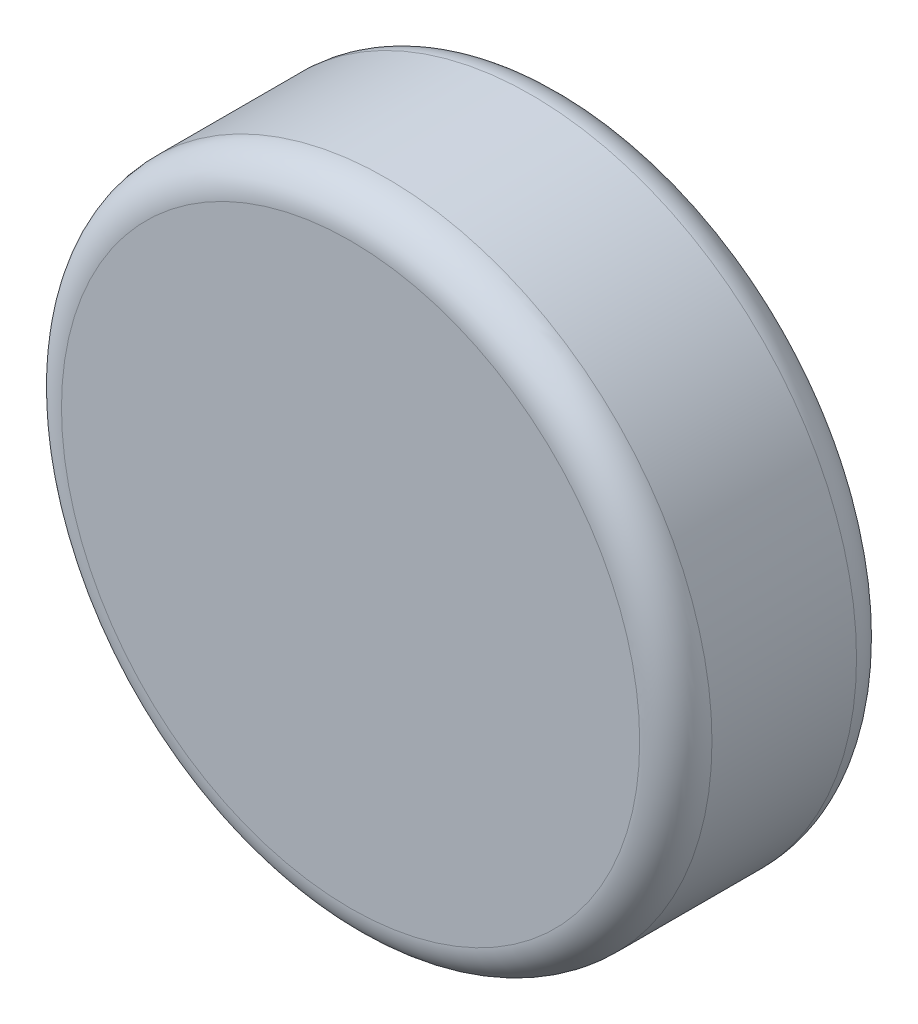
ISO-10303-21;
HEADER;
FILE_DESCRIPTION(('STEP AP214'),'2;1');
FILE_NAME('part.step','',(''),(''),'','','');
FILE_SCHEMA(('AUTOMOTIVE_DESIGN { 1 0 10303 214 1 1 1 1 }'));
ENDSEC;
DATA;
#1=APPLICATION_CONTEXT('core data for automotive mechanical design processes');
#2=APPLICATION_PROTOCOL_DEFINITION('international standard','automotive_design',2000,#1);
#3=PRODUCT_CONTEXT('',#1,'mechanical');
#4=PRODUCT('Part','Part','',(#3));
#5=PRODUCT_RELATED_PRODUCT_CATEGORY('part','',(#4));
#6=PRODUCT_DEFINITION_FORMATION('','',#4);
#7=PRODUCT_DEFINITION_CONTEXT('part definition',#1,'design');
#8=PRODUCT_DEFINITION('design','',#6,#7);
#9=PRODUCT_DEFINITION_SHAPE('','',#8);
#10=(LENGTH_UNIT() NAMED_UNIT(*) SI_UNIT(.MILLI.,.METRE.));
#11=(NAMED_UNIT(*) PLANE_ANGLE_UNIT() SI_UNIT($,.RADIAN.));
#12=(NAMED_UNIT(*) SI_UNIT($,.STERADIAN.) SOLID_ANGLE_UNIT());
#13=UNCERTAINTY_MEASURE_WITH_UNIT(LENGTH_MEASURE(1.E-05),#10,'distance_accuracy_value','');
#14=(GEOMETRIC_REPRESENTATION_CONTEXT(3) GLOBAL_UNCERTAINTY_ASSIGNED_CONTEXT((#13)) GLOBAL_UNIT_ASSIGNED_CONTEXT((#10,
#11,#12)) REPRESENTATION_CONTEXT('',''));
#15=CARTESIAN_POINT('',(0.,0.,0.));
#16=DIRECTION('',(0.,0.,1.));
#17=DIRECTION('',(1.,0.,0.));
#18=AXIS2_PLACEMENT_3D('',#15,#16,#17);
#19=CARTESIAN_POINT('',(89.4936999375922,-41.8829873578549,30.));
#20=DIRECTION('',(0.,0.,-1.));
#21=DIRECTION('',(-1.,0.,0.));
#22=AXIS2_PLACEMENT_3D('',#19,#20,#21);
#23=CYLINDRICAL_SURFACE('',#22,45.);
#24=CARTESIAN_POINT('',(89.4936999375922,-41.8829873578549,5.));
#25=DIRECTION('',(0.,0.,1.));
#26=DIRECTION('',(1.,0.,0.));
#27=AXIS2_PLACEMENT_3D('',#24,#25,#26);
#28=CIRCLE('',#27,45.);
#29=CARTESIAN_POINT('',(134.493699937592,-41.8829873578549,5.));
#30=VERTEX_POINT('',#29);
#31=EDGE_CURVE('E44',#30,#30,#28,.T.);
#32=ORIENTED_EDGE('',*,*,#31,.T.);
#33=EDGE_LOOP('',(#32));
#34=FACE_BOUND('',#33,.T.);
#35=CARTESIAN_POINT('',(89.4936999375922,-41.8829873578549,25.));
#36=DIRECTION('',(0.,0.,1.));
#37=DIRECTION('',(1.,0.,0.));
#38=AXIS2_PLACEMENT_3D('',#35,#36,#37);
#39=CIRCLE('',#38,45.);
#40=CARTESIAN_POINT('',(134.493699937592,-41.8829873578549,25.));
#41=VERTEX_POINT('',#40);
#42=EDGE_CURVE('E48',#41,#41,#39,.F.);
#43=ORIENTED_EDGE('',*,*,#42,.T.);
#44=EDGE_LOOP('',(#43));
#45=FACE_BOUND('',#44,.T.);
#46=ADVANCED_FACE('F33',(#34,#45),#23,.T.);
#47=CARTESIAN_POINT('',(89.4936999375922,-41.8829873578549,30.));
#48=DIRECTION('',(0.,0.,1.));
#49=DIRECTION('',(1.,0.,0.));
#50=AXIS2_PLACEMENT_3D('',#47,#48,#49);
#51=PLANE('',#50);
#52=CARTESIAN_POINT('',(89.4936999375922,-41.8829873578549,30.));
#53=DIRECTION('',(0.,0.,1.));
#54=DIRECTION('',(1.,0.,0.));
#55=AXIS2_PLACEMENT_3D('',#52,#53,#54);
#56=CIRCLE('',#55,40.);
#57=CARTESIAN_POINT('',(129.493699937592,-41.8829873578549,30.));
#58=VERTEX_POINT('',#57);
#59=EDGE_CURVE('E10',#58,#58,#56,.T.);
#60=ORIENTED_EDGE('',*,*,#59,.T.);
#61=EDGE_LOOP('',(#60));
#62=FACE_BOUND('',#61,.T.);
#63=ADVANCED_FACE('F64',(#62),#51,.T.);
#64=CARTESIAN_POINT('',(89.4936999375922,-41.8829873578549,0.));
#65=DIRECTION('',(0.,0.,1.));
#66=DIRECTION('',(1.,0.,0.));
#67=AXIS2_PLACEMENT_3D('',#64,#65,#66);
#68=PLANE('',#67);
#69=CARTESIAN_POINT('',(89.4936999375922,-41.8829873578549,0.));
#70=DIRECTION('',(0.,0.,1.));
#71=DIRECTION('',(1.,0.,0.));
#72=AXIS2_PLACEMENT_3D('',#69,#70,#71);
#73=CIRCLE('',#72,40.);
#74=CARTESIAN_POINT('',(129.493699937592,-41.8829873578549,0.));
#75=VERTEX_POINT('',#74);
#76=EDGE_CURVE('E40',#75,#75,#73,.F.);
#77=ORIENTED_EDGE('',*,*,#76,.T.);
#78=EDGE_LOOP('',(#77));
#79=FACE_BOUND('',#78,.T.);
#80=ADVANCED_FACE('F61',(#79),#68,.F.);
#81=CARTESIAN_POINT('',(89.4936999375922,-41.8829873578549,5.));
#82=DIRECTION('',(0.,0.,1.));
#83=DIRECTION('',(1.,0.,0.));
#84=AXIS2_PLACEMENT_3D('',#81,#82,#83);
#85=TOROIDAL_SURFACE('',#84,40.,5.);
#86=ORIENTED_EDGE('',*,*,#76,.F.);
#87=EDGE_LOOP('',(#86));
#88=FACE_BOUND('',#87,.T.);
#89=ORIENTED_EDGE('',*,*,#31,.F.);
#90=EDGE_LOOP('',(#89));
#91=FACE_BOUND('',#90,.T.);
#92=ADVANCED_FACE('F57',(#88,#91),#85,.T.);
#93=CARTESIAN_POINT('',(89.4936999375922,-41.8829873578549,25.));
#94=DIRECTION('',(0.,0.,1.));
#95=DIRECTION('',(1.,0.,0.));
#96=AXIS2_PLACEMENT_3D('',#93,#94,#95);
#97=TOROIDAL_SURFACE('',#96,40.,5.);
#98=ORIENTED_EDGE('',*,*,#42,.F.);
#99=EDGE_LOOP('',(#98));
#100=FACE_BOUND('',#99,.T.);
#101=ORIENTED_EDGE('',*,*,#59,.F.);
#102=EDGE_LOOP('',(#101));
#103=FACE_BOUND('',#102,.T.);
#104=ADVANCED_FACE('F35',(#100,#103),#97,.T.);
#105=CLOSED_SHELL('',(#46,#63,#80,#92,#104));
#106=MANIFOLD_SOLID_BREP('B2',#105);
#107=ADVANCED_BREP_SHAPE_REPRESENTATION('',(#18,#106),#14);
#108=SHAPE_DEFINITION_REPRESENTATION(#9,#107);
ENDSEC;
END-ISO-10303-21;
